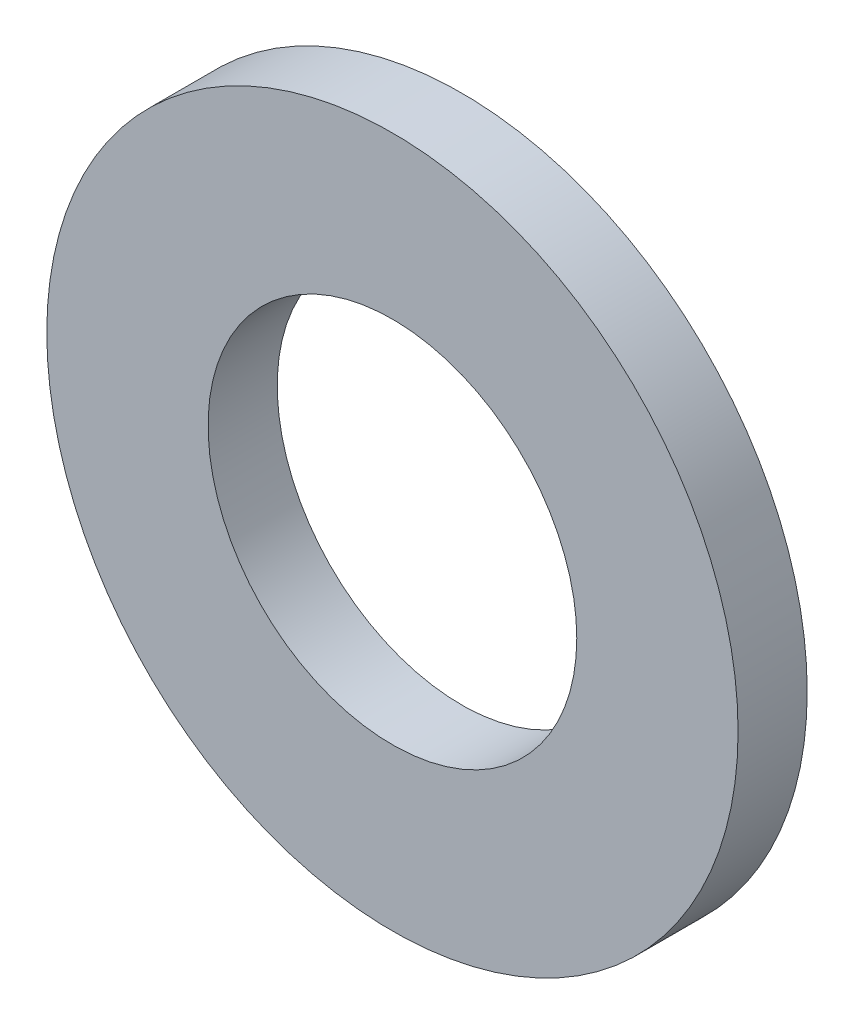
ISO-10303-21;
HEADER;
FILE_DESCRIPTION(('STEP AP214'),'2;1');
FILE_NAME('part.step','',(''),(''),'','','');
FILE_SCHEMA(('AUTOMOTIVE_DESIGN { 1 0 10303 214 1 1 1 1 }'));
ENDSEC;
DATA;
#1=APPLICATION_CONTEXT('core data for automotive mechanical design processes');
#2=APPLICATION_PROTOCOL_DEFINITION('international standard','automotive_design',2000,#1);
#3=PRODUCT_CONTEXT('',#1,'mechanical');
#4=PRODUCT('Part','Part','',(#3));
#5=PRODUCT_RELATED_PRODUCT_CATEGORY('part','',(#4));
#6=PRODUCT_DEFINITION_FORMATION('','',#4);
#7=PRODUCT_DEFINITION_CONTEXT('part definition',#1,'design');
#8=PRODUCT_DEFINITION('design','',#6,#7);
#9=PRODUCT_DEFINITION_SHAPE('','',#8);
#10=(LENGTH_UNIT() NAMED_UNIT(*) SI_UNIT(.MILLI.,.METRE.));
#11=(NAMED_UNIT(*) PLANE_ANGLE_UNIT() SI_UNIT($,.RADIAN.));
#12=(NAMED_UNIT(*) SI_UNIT($,.STERADIAN.) SOLID_ANGLE_UNIT());
#13=UNCERTAINTY_MEASURE_WITH_UNIT(LENGTH_MEASURE(1.E-05),#10,'distance_accuracy_value','');
#14=(GEOMETRIC_REPRESENTATION_CONTEXT(3) GLOBAL_UNCERTAINTY_ASSIGNED_CONTEXT((#13)) GLOBAL_UNIT_ASSIGNED_CONTEXT((#10,
#11,#12)) REPRESENTATION_CONTEXT('',''));
#15=CARTESIAN_POINT('',(0.,0.,0.));
#16=DIRECTION('',(0.,0.,1.));
#17=DIRECTION('',(1.,0.,0.));
#18=AXIS2_PLACEMENT_3D('',#15,#16,#17);
#19=CARTESIAN_POINT('',(0.,0.,3.));
#20=DIRECTION('',(0.,0.,1.));
#21=DIRECTION('',(1.,0.,0.));
#22=AXIS2_PLACEMENT_3D('',#19,#20,#21);
#23=PLANE('',#22);
#24=CARTESIAN_POINT('',(0.,0.,3.));
#25=DIRECTION('',(0.,0.,1.));
#26=DIRECTION('',(1.,0.,0.));
#27=AXIS2_PLACEMENT_3D('',#24,#25,#26);
#28=CIRCLE('',#27,15.);
#29=CARTESIAN_POINT('',(15.,0.,3.));
#30=VERTEX_POINT('',#29);
#31=EDGE_CURVE('E10',#30,#30,#28,.T.);
#32=ORIENTED_EDGE('',*,*,#31,.T.);
#33=EDGE_LOOP('',(#32));
#34=FACE_BOUND('',#33,.T.);
#35=CARTESIAN_POINT('',(0.,0.,3.));
#36=DIRECTION('',(0.,0.,1.));
#37=DIRECTION('',(1.,0.,0.));
#38=AXIS2_PLACEMENT_3D('',#35,#36,#37);
#39=CIRCLE('',#38,8.);
#40=CARTESIAN_POINT('',(8.,0.,3.));
#41=VERTEX_POINT('',#40);
#42=EDGE_CURVE('E44',#41,#41,#39,.T.);
#43=ORIENTED_EDGE('',*,*,#42,.F.);
#44=EDGE_LOOP('',(#43));
#45=FACE_BOUND('',#44,.T.);
#46=ADVANCED_FACE('F33',(#34,#45),#23,.T.);
#47=CARTESIAN_POINT('',(0.,0.,0.));
#48=DIRECTION('',(0.,0.,1.));
#49=DIRECTION('',(1.,0.,0.));
#50=AXIS2_PLACEMENT_3D('',#47,#48,#49);
#51=PLANE('',#50);
#52=CARTESIAN_POINT('',(0.,0.,0.));
#53=DIRECTION('',(0.,0.,1.));
#54=DIRECTION('',(1.,0.,0.));
#55=AXIS2_PLACEMENT_3D('',#52,#53,#54);
#56=CIRCLE('',#55,15.);
#57=CARTESIAN_POINT('',(15.,0.,0.));
#58=VERTEX_POINT('',#57);
#59=EDGE_CURVE('E37',#58,#58,#56,.T.);
#60=ORIENTED_EDGE('',*,*,#59,.F.);
#61=EDGE_LOOP('',(#60));
#62=FACE_BOUND('',#61,.T.);
#63=CARTESIAN_POINT('',(0.,0.,0.));
#64=DIRECTION('',(0.,0.,1.));
#65=DIRECTION('',(1.,0.,0.));
#66=AXIS2_PLACEMENT_3D('',#63,#64,#65);
#67=CIRCLE('',#66,8.);
#68=CARTESIAN_POINT('',(8.,0.,0.));
#69=VERTEX_POINT('',#68);
#70=EDGE_CURVE('E46',#69,#69,#67,.T.);
#71=ORIENTED_EDGE('',*,*,#70,.T.);
#72=EDGE_LOOP('',(#71));
#73=FACE_BOUND('',#72,.T.);
#74=ADVANCED_FACE('F56',(#62,#73),#51,.F.);
#75=CARTESIAN_POINT('',(0.,0.,3.));
#76=DIRECTION('',(0.,0.,-1.));
#77=DIRECTION('',(-1.,0.,0.));
#78=AXIS2_PLACEMENT_3D('',#75,#76,#77);
#79=CYLINDRICAL_SURFACE('',#78,15.);
#80=ORIENTED_EDGE('',*,*,#31,.F.);
#81=EDGE_LOOP('',(#80));
#82=FACE_BOUND('',#81,.T.);
#83=ORIENTED_EDGE('',*,*,#59,.T.);
#84=EDGE_LOOP('',(#83));
#85=FACE_BOUND('',#84,.T.);
#86=ADVANCED_FACE('F35',(#82,#85),#79,.T.);
#87=CARTESIAN_POINT('',(0.,0.,3.));
#88=DIRECTION('',(0.,0.,-1.));
#89=DIRECTION('',(-1.,0.,0.));
#90=AXIS2_PLACEMENT_3D('',#87,#88,#89);
#91=CYLINDRICAL_SURFACE('',#90,8.);
#92=ORIENTED_EDGE('',*,*,#42,.T.);
#93=EDGE_LOOP('',(#92));
#94=FACE_BOUND('',#93,.T.);
#95=ORIENTED_EDGE('',*,*,#70,.F.);
#96=EDGE_LOOP('',(#95));
#97=FACE_BOUND('',#96,.T.);
#98=ADVANCED_FACE('F52',(#94,#97),#91,.F.);
#99=CLOSED_SHELL('',(#46,#74,#86,#98));
#100=MANIFOLD_SOLID_BREP('B2',#99);
#101=ADVANCED_BREP_SHAPE_REPRESENTATION('',(#18,#100),#14);
#102=SHAPE_DEFINITION_REPRESENTATION(#9,#101);
ENDSEC;
END-ISO-10303-21;
